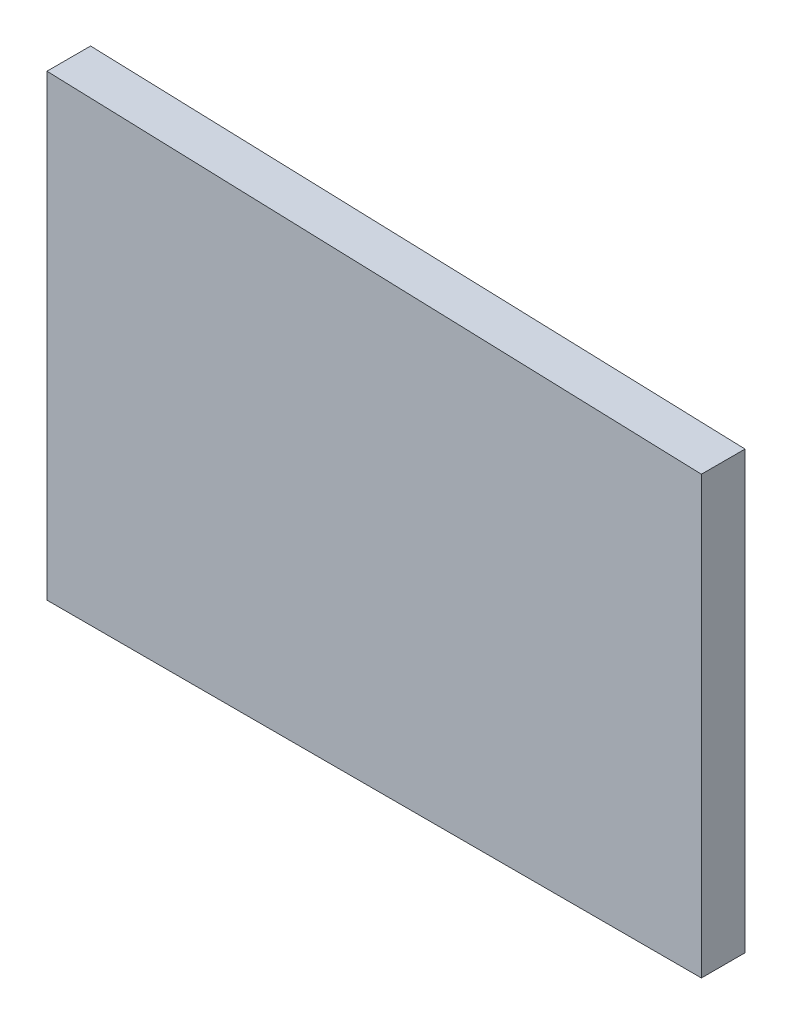
ISO-10303-21;
HEADER;
FILE_DESCRIPTION(('STEP AP214'),'2;1');
FILE_NAME('part.step','',(''),(''),'','','');
FILE_SCHEMA(('AUTOMOTIVE_DESIGN { 1 0 10303 214 1 1 1 1 }'));
ENDSEC;
DATA;
#1=APPLICATION_CONTEXT('core data for automotive mechanical design processes');
#2=APPLICATION_PROTOCOL_DEFINITION('international standard','automotive_design',2000,#1);
#3=PRODUCT_CONTEXT('',#1,'mechanical');
#4=PRODUCT('Part','Part','',(#3));
#5=PRODUCT_RELATED_PRODUCT_CATEGORY('part','',(#4));
#6=PRODUCT_DEFINITION_FORMATION('','',#4);
#7=PRODUCT_DEFINITION_CONTEXT('part definition',#1,'design');
#8=PRODUCT_DEFINITION('design','',#6,#7);
#9=PRODUCT_DEFINITION_SHAPE('','',#8);
#10=(LENGTH_UNIT() NAMED_UNIT(*) SI_UNIT(.MILLI.,.METRE.));
#11=(NAMED_UNIT(*) PLANE_ANGLE_UNIT() SI_UNIT($,.RADIAN.));
#12=(NAMED_UNIT(*) SI_UNIT($,.STERADIAN.) SOLID_ANGLE_UNIT());
#13=UNCERTAINTY_MEASURE_WITH_UNIT(LENGTH_MEASURE(1.E-05),#10,'distance_accuracy_value','');
#14=(GEOMETRIC_REPRESENTATION_CONTEXT(3) GLOBAL_UNCERTAINTY_ASSIGNED_CONTEXT((#13)) GLOBAL_UNIT_ASSIGNED_CONTEXT((#10,
#11,#12)) REPRESENTATION_CONTEXT('',''));
#15=CARTESIAN_POINT('',(0.,0.,0.));
#16=DIRECTION('',(0.,0.,1.));
#17=DIRECTION('',(1.,0.,0.));
#18=AXIS2_PLACEMENT_3D('',#15,#16,#17);
#19=CARTESIAN_POINT('',(30.,0.,2.));
#20=DIRECTION('',(0.,1.,0.));
#21=DIRECTION('',(-1.,0.,0.));
#22=AXIS2_PLACEMENT_3D('',#19,#20,#21);
#23=PLANE('',#22);
#24=DIRECTION('',(1.,0.,0.));
#25=VECTOR('',#24,1.);
#26=CARTESIAN_POINT('',(30.,0.,0.));
#27=LINE('',#26,#25);
#28=CARTESIAN_POINT('',(0.,0.,0.));
#29=VERTEX_POINT('',#28);
#30=CARTESIAN_POINT('',(30.,0.,0.));
#31=VERTEX_POINT('',#30);
#32=EDGE_CURVE('E101',#29,#31,#27,.T.);
#33=ORIENTED_EDGE('',*,*,#32,.T.);
#34=DIRECTION('',(0.,0.,-1.));
#35=VECTOR('',#34,1.);
#36=CARTESIAN_POINT('',(30.,0.,2.));
#37=LINE('',#36,#35);
#38=CARTESIAN_POINT('',(30.,0.,2.));
#39=VERTEX_POINT('',#38);
#40=EDGE_CURVE('E11',#39,#31,#37,.T.);
#41=ORIENTED_EDGE('',*,*,#40,.F.);
#42=DIRECTION('',(1.,0.,0.));
#43=VECTOR('',#42,1.);
#44=CARTESIAN_POINT('',(30.,0.,2.));
#45=LINE('',#44,#43);
#46=CARTESIAN_POINT('',(0.,0.,2.));
#47=VERTEX_POINT('',#46);
#48=EDGE_CURVE('E89',#47,#39,#45,.T.);
#49=ORIENTED_EDGE('',*,*,#48,.F.);
#50=DIRECTION('',(0.,0.,-1.));
#51=VECTOR('',#50,1.);
#52=CARTESIAN_POINT('',(0.,0.,2.));
#53=LINE('',#52,#51);
#54=EDGE_CURVE('E97',#47,#29,#53,.T.);
#55=ORIENTED_EDGE('',*,*,#54,.T.);
#56=EDGE_LOOP('',(#33,#41,#49,#55));
#57=FACE_BOUND('',#56,.T.);
#58=ADVANCED_FACE('F38',(#57),#23,.F.);
#59=CARTESIAN_POINT('',(29.9999999999999,20.,2.));
#60=DIRECTION('',(-1.,0.,0.));
#61=DIRECTION('',(0.,-1.,0.));
#62=AXIS2_PLACEMENT_3D('',#59,#60,#61);
#63=PLANE('',#62);
#64=DIRECTION('',(0.,1.,0.));
#65=VECTOR('',#64,1.);
#66=CARTESIAN_POINT('',(29.9999999999999,20.,0.));
#67=LINE('',#66,#65);
#68=CARTESIAN_POINT('',(29.9999999999999,20.,0.));
#69=VERTEX_POINT('',#68);
#70=EDGE_CURVE('E93',#31,#69,#67,.T.);
#71=ORIENTED_EDGE('',*,*,#70,.T.);
#72=DIRECTION('',(0.,0.,-1.));
#73=VECTOR('',#72,1.);
#74=CARTESIAN_POINT('',(29.9999999999999,20.,2.));
#75=LINE('',#74,#73);
#76=CARTESIAN_POINT('',(29.9999999999999,20.,2.));
#77=VERTEX_POINT('',#76);
#78=EDGE_CURVE('E46',#77,#69,#75,.T.);
#79=ORIENTED_EDGE('',*,*,#78,.F.);
#80=DIRECTION('',(0.,1.,0.));
#81=VECTOR('',#80,1.);
#82=CARTESIAN_POINT('',(29.9999999999999,20.,2.));
#83=LINE('',#82,#81);
#84=EDGE_CURVE('E84',#39,#77,#83,.T.);
#85=ORIENTED_EDGE('',*,*,#84,.F.);
#86=ORIENTED_EDGE('',*,*,#40,.T.);
#87=EDGE_LOOP('',(#71,#79,#85,#86));
#88=FACE_BOUND('',#87,.T.);
#89=ADVANCED_FACE('F92',(#88),#63,.F.);
#90=CARTESIAN_POINT('',(0.,21.,2.));
#91=DIRECTION('',(-0.0333148302326387,-0.999444906979154,0.));
#92=DIRECTION('',(0.999444906979154,-0.0333148302326387,0.));
#93=AXIS2_PLACEMENT_3D('',#90,#91,#92);
#94=PLANE('',#93);
#95=DIRECTION('',(-0.999444906979154,0.0333148302326387,0.));
#96=VECTOR('',#95,1.);
#97=CARTESIAN_POINT('',(0.,21.,0.));
#98=LINE('',#97,#96);
#99=CARTESIAN_POINT('',(0.,21.,0.));
#100=VERTEX_POINT('',#99);
#101=EDGE_CURVE('E71',#69,#100,#98,.T.);
#102=ORIENTED_EDGE('',*,*,#101,.T.);
#103=DIRECTION('',(0.,0.,-1.));
#104=VECTOR('',#103,1.);
#105=CARTESIAN_POINT('',(0.,21.,2.));
#106=LINE('',#105,#104);
#107=CARTESIAN_POINT('',(0.,21.,2.));
#108=VERTEX_POINT('',#107);
#109=EDGE_CURVE('E94',#108,#100,#106,.T.);
#110=ORIENTED_EDGE('',*,*,#109,.F.);
#111=DIRECTION('',(-0.999444906979154,0.0333148302326387,0.));
#112=VECTOR('',#111,1.);
#113=CARTESIAN_POINT('',(0.,21.,2.));
#114=LINE('',#113,#112);
#115=EDGE_CURVE('E87',#77,#108,#114,.T.);
#116=ORIENTED_EDGE('',*,*,#115,.F.);
#117=ORIENTED_EDGE('',*,*,#78,.T.);
#118=EDGE_LOOP('',(#102,#110,#116,#117));
#119=FACE_BOUND('',#118,.T.);
#120=ADVANCED_FACE('F95',(#119),#94,.F.);
#121=CARTESIAN_POINT('',(0.,0.,2.));
#122=DIRECTION('',(1.,0.,0.));
#123=DIRECTION('',(0.,1.,0.));
#124=AXIS2_PLACEMENT_3D('',#121,#122,#123);
#125=PLANE('',#124);
#126=DIRECTION('',(0.,-1.,0.));
#127=VECTOR('',#126,1.);
#128=CARTESIAN_POINT('',(0.,0.,0.));
#129=LINE('',#128,#127);
#130=EDGE_CURVE('E77',#100,#29,#129,.T.);
#131=ORIENTED_EDGE('',*,*,#130,.T.);
#132=ORIENTED_EDGE('',*,*,#54,.F.);
#133=DIRECTION('',(0.,-1.,0.));
#134=VECTOR('',#133,1.);
#135=CARTESIAN_POINT('',(0.,0.,2.));
#136=LINE('',#135,#134);
#137=EDGE_CURVE('E54',#108,#47,#136,.T.);
#138=ORIENTED_EDGE('',*,*,#137,.F.);
#139=ORIENTED_EDGE('',*,*,#109,.T.);
#140=EDGE_LOOP('',(#131,#132,#138,#139));
#141=FACE_BOUND('',#140,.T.);
#142=ADVANCED_FACE('F108',(#141),#125,.F.);
#143=CARTESIAN_POINT('',(0.,0.,2.));
#144=DIRECTION('',(0.,0.,-1.));
#145=DIRECTION('',(-1.,0.,0.));
#146=AXIS2_PLACEMENT_3D('',#143,#144,#145);
#147=PLANE('',#146);
#148=ORIENTED_EDGE('',*,*,#48,.T.);
#149=ORIENTED_EDGE('',*,*,#84,.T.);
#150=ORIENTED_EDGE('',*,*,#115,.T.);
#151=ORIENTED_EDGE('',*,*,#137,.T.);
#152=EDGE_LOOP('',(#148,#149,#150,#151));
#153=FACE_BOUND('',#152,.T.);
#154=ADVANCED_FACE('F85',(#153),#147,.F.);
#155=CARTESIAN_POINT('',(0.,0.,0.));
#156=DIRECTION('',(0.,0.,-1.));
#157=DIRECTION('',(-1.,0.,0.));
#158=AXIS2_PLACEMENT_3D('',#155,#156,#157);
#159=PLANE('',#158);
#160=ORIENTED_EDGE('',*,*,#32,.F.);
#161=ORIENTED_EDGE('',*,*,#130,.F.);
#162=ORIENTED_EDGE('',*,*,#101,.F.);
#163=ORIENTED_EDGE('',*,*,#70,.F.);
#164=EDGE_LOOP('',(#160,#161,#162,#163));
#165=FACE_BOUND('',#164,.T.);
#166=ADVANCED_FACE('F111',(#165),#159,.T.);
#167=CLOSED_SHELL('',(#58,#89,#120,#142,#154,#166));
#168=MANIFOLD_SOLID_BREP('B2',#167);
#169=ADVANCED_BREP_SHAPE_REPRESENTATION('',(#18,#168),#14);
#170=SHAPE_DEFINITION_REPRESENTATION(#9,#169);
ENDSEC;
END-ISO-10303-21;
